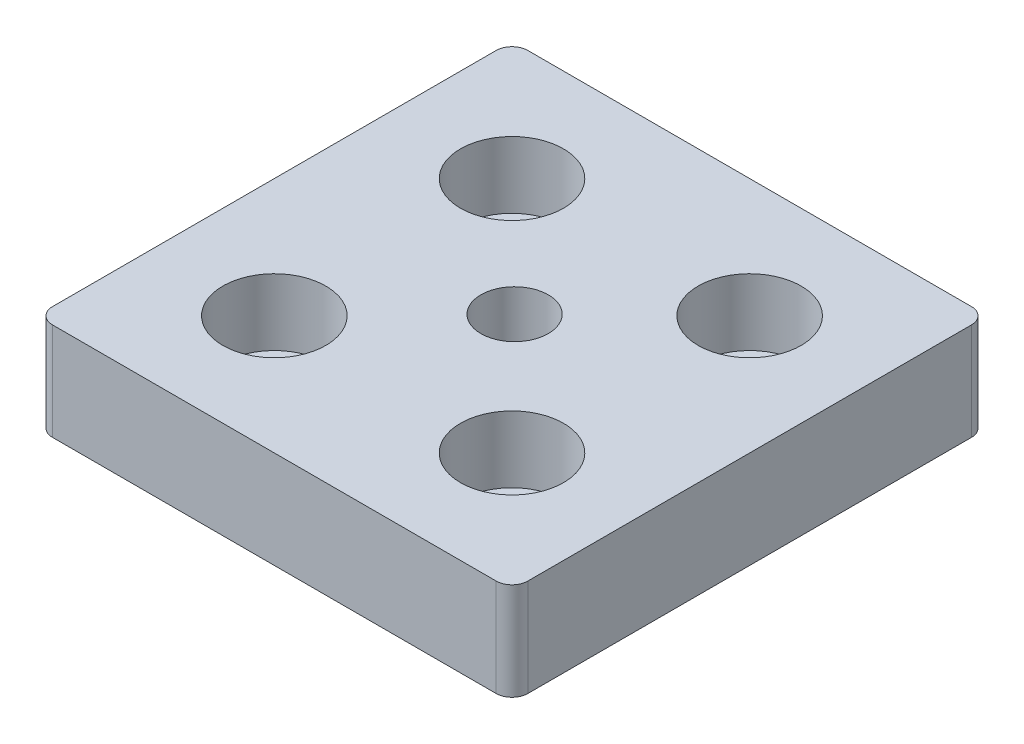
ISO-10303-21;
HEADER;
FILE_DESCRIPTION(('STEP AP214'),'2;1');
FILE_NAME('part.step','',(''),(''),'','','');
FILE_SCHEMA(('AUTOMOTIVE_DESIGN { 1 0 10303 214 1 1 1 1 }'));
ENDSEC;
DATA;
#1=APPLICATION_CONTEXT('core data for automotive mechanical design processes');
#2=APPLICATION_PROTOCOL_DEFINITION('international standard','automotive_design',2000,#1);
#3=PRODUCT_CONTEXT('',#1,'mechanical');
#4=PRODUCT('Part','Part','',(#3));
#5=PRODUCT_RELATED_PRODUCT_CATEGORY('part','',(#4));
#6=PRODUCT_DEFINITION_FORMATION('','',#4);
#7=PRODUCT_DEFINITION_CONTEXT('part definition',#1,'design');
#8=PRODUCT_DEFINITION('design','',#6,#7);
#9=PRODUCT_DEFINITION_SHAPE('','',#8);
#10=(LENGTH_UNIT() NAMED_UNIT(*) SI_UNIT(.MILLI.,.METRE.));
#11=(NAMED_UNIT(*) PLANE_ANGLE_UNIT() SI_UNIT($,.RADIAN.));
#12=(NAMED_UNIT(*) SI_UNIT($,.STERADIAN.) SOLID_ANGLE_UNIT());
#13=UNCERTAINTY_MEASURE_WITH_UNIT(LENGTH_MEASURE(1.E-05),#10,'distance_accuracy_value','');
#14=(GEOMETRIC_REPRESENTATION_CONTEXT(3) GLOBAL_UNCERTAINTY_ASSIGNED_CONTEXT((#13)) GLOBAL_UNIT_ASSIGNED_CONTEXT((#10,
#11,#12)) REPRESENTATION_CONTEXT('',''));
#15=CARTESIAN_POINT('',(0.,0.,0.));
#16=DIRECTION('',(0.,0.,1.));
#17=DIRECTION('',(1.,0.,0.));
#18=AXIS2_PLACEMENT_3D('',#15,#16,#17);
#19=CARTESIAN_POINT('',(-14.993607342611,12.3,15.3305364339358));
#20=DIRECTION('',(0.,-1.,0.));
#21=DIRECTION('',(0.,0.,-1.));
#22=AXIS2_PLACEMENT_3D('',#19,#20,#21);
#23=CYLINDRICAL_SURFACE('',#22,4.5);
#24=CARTESIAN_POINT('',(-14.993607342611,0.,15.3305364339358));
#25=DIRECTION('',(0.,1.,0.));
#26=DIRECTION('',(0.,0.,1.));
#27=AXIS2_PLACEMENT_3D('',#24,#25,#26);
#28=CIRCLE('',#27,4.5);
#29=CARTESIAN_POINT('',(-14.993607342611,0.,19.8305364339358));
#30=VERTEX_POINT('',#29);
#31=EDGE_CURVE('E202',#30,#30,#28,.T.);
#32=ORIENTED_EDGE('',*,*,#31,.F.);
#33=EDGE_LOOP('',(#32));
#34=FACE_BOUND('',#33,.T.);
#35=CARTESIAN_POINT('',(-14.993607342611,3.9,15.3305364339358));
#36=DIRECTION('',(0.,1.,0.));
#37=DIRECTION('',(0.,0.,1.));
#38=AXIS2_PLACEMENT_3D('',#35,#36,#37);
#39=CIRCLE('',#38,4.5);
#40=CARTESIAN_POINT('',(-14.993607342611,3.9,19.8305364339358));
#41=VERTEX_POINT('',#40);
#42=EDGE_CURVE('E41',#41,#41,#39,.T.);
#43=ORIENTED_EDGE('',*,*,#42,.T.);
#44=EDGE_LOOP('',(#43));
#45=FACE_BOUND('',#44,.T.);
#46=ADVANCED_FACE('F37',(#34,#45),#23,.F.);
#47=CARTESIAN_POINT('',(15.006392657389,12.3,15.3305364339356));
#48=DIRECTION('',(0.,-1.,0.));
#49=DIRECTION('',(0.,0.,-1.));
#50=AXIS2_PLACEMENT_3D('',#47,#48,#49);
#51=CYLINDRICAL_SURFACE('',#50,4.5);
#52=CARTESIAN_POINT('',(15.006392657389,0.,15.3305364339356));
#53=DIRECTION('',(0.,1.,0.));
#54=DIRECTION('',(0.,0.,1.));
#55=AXIS2_PLACEMENT_3D('',#52,#53,#54);
#56=CIRCLE('',#55,4.5);
#57=CARTESIAN_POINT('',(15.006392657389,0.,19.8305364339356));
#58=VERTEX_POINT('',#57);
#59=EDGE_CURVE('E140',#58,#58,#56,.T.);
#60=ORIENTED_EDGE('',*,*,#59,.F.);
#61=EDGE_LOOP('',(#60));
#62=FACE_BOUND('',#61,.T.);
#63=CARTESIAN_POINT('',(15.006392657389,3.9,15.3305364339356));
#64=DIRECTION('',(0.,1.,0.));
#65=DIRECTION('',(0.,0.,1.));
#66=AXIS2_PLACEMENT_3D('',#63,#64,#65);
#67=CIRCLE('',#66,4.5);
#68=CARTESIAN_POINT('',(15.006392657389,3.9,19.8305364339356));
#69=VERTEX_POINT('',#68);
#70=EDGE_CURVE('E172',#69,#69,#67,.T.);
#71=ORIENTED_EDGE('',*,*,#70,.T.);
#72=EDGE_LOOP('',(#71));
#73=FACE_BOUND('',#72,.T.);
#74=ADVANCED_FACE('F250',(#62,#73),#51,.F.);
#75=CARTESIAN_POINT('',(15.006392657389,12.3,-14.6694635660642));
#76=DIRECTION('',(0.,-1.,0.));
#77=DIRECTION('',(0.,0.,-1.));
#78=AXIS2_PLACEMENT_3D('',#75,#76,#77);
#79=CYLINDRICAL_SURFACE('',#78,4.5);
#80=CARTESIAN_POINT('',(15.006392657389,0.,-14.6694635660642));
#81=DIRECTION('',(0.,1.,0.));
#82=DIRECTION('',(0.,0.,1.));
#83=AXIS2_PLACEMENT_3D('',#80,#81,#82);
#84=CIRCLE('',#83,4.5);
#85=CARTESIAN_POINT('',(15.006392657389,0.,-10.1694635660642));
#86=VERTEX_POINT('',#85);
#87=EDGE_CURVE('E208',#86,#86,#84,.T.);
#88=ORIENTED_EDGE('',*,*,#87,.F.);
#89=EDGE_LOOP('',(#88));
#90=FACE_BOUND('',#89,.T.);
#91=CARTESIAN_POINT('',(15.006392657389,3.9,-14.6694635660642));
#92=DIRECTION('',(0.,1.,0.));
#93=DIRECTION('',(0.,0.,1.));
#94=AXIS2_PLACEMENT_3D('',#91,#92,#93);
#95=CIRCLE('',#94,4.5);
#96=CARTESIAN_POINT('',(15.006392657389,3.9,-10.1694635660642));
#97=VERTEX_POINT('',#96);
#98=EDGE_CURVE('E168',#97,#97,#95,.T.);
#99=ORIENTED_EDGE('',*,*,#98,.T.);
#100=EDGE_LOOP('',(#99));
#101=FACE_BOUND('',#100,.T.);
#102=ADVANCED_FACE('F256',(#90,#101),#79,.F.);
#103=CARTESIAN_POINT('',(-14.9936073426113,12.3,-14.6694635660642));
#104=DIRECTION('',(0.,-1.,0.));
#105=DIRECTION('',(0.,0.,-1.));
#106=AXIS2_PLACEMENT_3D('',#103,#104,#105);
#107=CYLINDRICAL_SURFACE('',#106,4.5);
#108=CARTESIAN_POINT('',(-14.9936073426113,0.,-14.6694635660642));
#109=DIRECTION('',(0.,1.,0.));
#110=DIRECTION('',(0.,0.,1.));
#111=AXIS2_PLACEMENT_3D('',#108,#109,#110);
#112=CIRCLE('',#111,4.5);
#113=CARTESIAN_POINT('',(-14.9936073426113,0.,-10.1694635660642));
#114=VERTEX_POINT('',#113);
#115=EDGE_CURVE('E205',#114,#114,#112,.T.);
#116=ORIENTED_EDGE('',*,*,#115,.F.);
#117=EDGE_LOOP('',(#116));
#118=FACE_BOUND('',#117,.T.);
#119=CARTESIAN_POINT('',(-14.9936073426113,3.9,-14.6694635660642));
#120=DIRECTION('',(0.,1.,0.));
#121=DIRECTION('',(0.,0.,1.));
#122=AXIS2_PLACEMENT_3D('',#119,#120,#121);
#123=CIRCLE('',#122,4.5);
#124=CARTESIAN_POINT('',(-14.9936073426113,3.9,-10.1694635660642));
#125=VERTEX_POINT('',#124);
#126=EDGE_CURVE('E163',#125,#125,#123,.T.);
#127=ORIENTED_EDGE('',*,*,#126,.T.);
#128=EDGE_LOOP('',(#127));
#129=FACE_BOUND('',#128,.T.);
#130=ADVANCED_FACE('F263',(#118,#129),#107,.F.);
#131=CARTESIAN_POINT('',(-27.993607342611,12.3,28.3305364339356));
#132=DIRECTION('',(0.,1.,0.));
#133=DIRECTION('',(0.,0.,1.));
#134=AXIS2_PLACEMENT_3D('',#131,#132,#133);
#135=PLANE('',#134);
#136=CARTESIAN_POINT('',(-14.993607342611,12.3,15.3305364339358));
#137=DIRECTION('',(0.,1.,0.));
#138=DIRECTION('',(0.,0.,1.));
#139=AXIS2_PLACEMENT_3D('',#136,#137,#138);
#140=CIRCLE('',#139,6.5);
#141=CARTESIAN_POINT('',(-14.993607342611,12.3,21.8305364339358));
#142=VERTEX_POINT('',#141);
#143=EDGE_CURVE('E188',#142,#142,#140,.T.);
#144=ORIENTED_EDGE('',*,*,#143,.F.);
#145=EDGE_LOOP('',(#144));
#146=FACE_BOUND('',#145,.T.);
#147=CARTESIAN_POINT('',(15.006392657389,12.3,15.3305364339356));
#148=DIRECTION('',(0.,1.,0.));
#149=DIRECTION('',(0.,0.,1.));
#150=AXIS2_PLACEMENT_3D('',#147,#148,#149);
#151=CIRCLE('',#150,6.5);
#152=CARTESIAN_POINT('',(15.006392657389,12.3,21.8305364339356));
#153=VERTEX_POINT('',#152);
#154=EDGE_CURVE('E181',#153,#153,#151,.T.);
#155=ORIENTED_EDGE('',*,*,#154,.F.);
#156=EDGE_LOOP('',(#155));
#157=FACE_BOUND('',#156,.T.);
#158=CARTESIAN_POINT('',(15.006392657389,12.3,-14.6694635660642));
#159=DIRECTION('',(0.,1.,0.));
#160=DIRECTION('',(0.,0.,1.));
#161=AXIS2_PLACEMENT_3D('',#158,#159,#160);
#162=CIRCLE('',#161,6.5);
#163=CARTESIAN_POINT('',(15.006392657389,12.3,-8.16946356606417));
#164=VERTEX_POINT('',#163);
#165=EDGE_CURVE('E174',#164,#164,#162,.T.);
#166=ORIENTED_EDGE('',*,*,#165,.F.);
#167=EDGE_LOOP('',(#166));
#168=FACE_BOUND('',#167,.T.);
#169=CARTESIAN_POINT('',(-14.9936073426113,12.3,-14.6694635660642));
#170=DIRECTION('',(0.,1.,0.));
#171=DIRECTION('',(0.,0.,1.));
#172=AXIS2_PLACEMENT_3D('',#169,#170,#171);
#173=CIRCLE('',#172,6.5);
#174=CARTESIAN_POINT('',(-14.9936073426113,12.3,-8.16946356606417));
#175=VERTEX_POINT('',#174);
#176=EDGE_CURVE('E170',#175,#175,#173,.T.);
#177=ORIENTED_EDGE('',*,*,#176,.F.);
#178=EDGE_LOOP('',(#177));
#179=FACE_BOUND('',#178,.T.);
#180=CARTESIAN_POINT('',(0.,12.3,0.));
#181=DIRECTION('',(0.,1.,0.));
#182=DIRECTION('',(0.,0.,1.));
#183=AXIS2_PLACEMENT_3D('',#180,#181,#182);
#184=CIRCLE('',#183,4.25);
#185=CARTESIAN_POINT('',(0.,12.3,4.25));
#186=VERTEX_POINT('',#185);
#187=EDGE_CURVE('E166',#186,#186,#184,.T.);
#188=ORIENTED_EDGE('',*,*,#187,.F.);
#189=EDGE_LOOP('',(#188));
#190=FACE_BOUND('',#189,.T.);
#191=CARTESIAN_POINT('',(-27.993607342611,12.3,28.3305364339356));
#192=DIRECTION('',(0.,1.,0.));
#193=DIRECTION('',(0.,0.,1.));
#194=AXIS2_PLACEMENT_3D('',#191,#192,#193);
#195=CIRCLE('',#194,2.);
#196=CARTESIAN_POINT('',(-29.993607342611,12.3,28.3305364339356));
#197=VERTEX_POINT('',#196);
#198=CARTESIAN_POINT('',(-27.993607342611,12.3,30.3305364339356));
#199=VERTEX_POINT('',#198);
#200=EDGE_CURVE('E151',#197,#199,#195,.T.);
#201=ORIENTED_EDGE('',*,*,#200,.T.);
#202=DIRECTION('',(1.,0.,0.));
#203=VECTOR('',#202,1.);
#204=CARTESIAN_POINT('',(-27.993607342611,12.3,30.3305364339356));
#205=LINE('',#204,#203);
#206=CARTESIAN_POINT('',(28.0063926573892,12.3,30.3305364339356));
#207=VERTEX_POINT('',#206);
#208=EDGE_CURVE('E99',#199,#207,#205,.T.);
#209=ORIENTED_EDGE('',*,*,#208,.T.);
#210=CARTESIAN_POINT('',(28.0063926573892,12.3,28.3305364339356));
#211=DIRECTION('',(0.,1.,0.));
#212=DIRECTION('',(0.,0.,1.));
#213=AXIS2_PLACEMENT_3D('',#210,#211,#212);
#214=CIRCLE('',#213,1.99999999999999);
#215=CARTESIAN_POINT('',(30.0063926573892,12.3,28.3305364339356));
#216=VERTEX_POINT('',#215);
#217=EDGE_CURVE('E215',#207,#216,#214,.T.);
#218=ORIENTED_EDGE('',*,*,#217,.T.);
#219=DIRECTION('',(0.,0.,-1.));
#220=VECTOR('',#219,1.);
#221=CARTESIAN_POINT('',(30.0063926573892,12.3,28.3305364339356));
#222=LINE('',#221,#220);
#223=CARTESIAN_POINT('',(30.0063926573892,12.3,-27.6694635660644));
#224=VERTEX_POINT('',#223);
#225=EDGE_CURVE('E217',#216,#224,#222,.T.);
#226=ORIENTED_EDGE('',*,*,#225,.T.);
#227=CARTESIAN_POINT('',(28.0063926573892,12.3,-27.6694635660644));
#228=DIRECTION('',(0.,1.,0.));
#229=DIRECTION('',(0.,0.,1.));
#230=AXIS2_PLACEMENT_3D('',#227,#228,#229);
#231=CIRCLE('',#230,2.);
#232=CARTESIAN_POINT('',(28.0063926573892,12.3,-29.6694635660644));
#233=VERTEX_POINT('',#232);
#234=EDGE_CURVE('E118',#224,#233,#231,.T.);
#235=ORIENTED_EDGE('',*,*,#234,.T.);
#236=DIRECTION('',(-1.,0.,0.));
#237=VECTOR('',#236,1.);
#238=CARTESIAN_POINT('',(28.0063926573892,12.3,-29.6694635660644));
#239=LINE('',#238,#237);
#240=CARTESIAN_POINT('',(-27.993607342611,12.3,-29.6694635660644));
#241=VERTEX_POINT('',#240);
#242=EDGE_CURVE('E112',#233,#241,#239,.T.);
#243=ORIENTED_EDGE('',*,*,#242,.T.);
#244=CARTESIAN_POINT('',(-27.993607342611,12.3,-27.6694635660644));
#245=DIRECTION('',(0.,1.,0.));
#246=DIRECTION('',(0.,0.,1.));
#247=AXIS2_PLACEMENT_3D('',#244,#245,#246);
#248=CIRCLE('',#247,2.);
#249=CARTESIAN_POINT('',(-29.993607342611,12.3,-27.6694635660644));
#250=VERTEX_POINT('',#249);
#251=EDGE_CURVE('E116',#241,#250,#248,.T.);
#252=ORIENTED_EDGE('',*,*,#251,.T.);
#253=DIRECTION('',(0.,0.,1.));
#254=VECTOR('',#253,1.);
#255=CARTESIAN_POINT('',(-29.993607342611,12.3,-27.6694635660644));
#256=LINE('',#255,#254);
#257=EDGE_CURVE('E56',#250,#197,#256,.T.);
#258=ORIENTED_EDGE('',*,*,#257,.T.);
#259=EDGE_LOOP('',(#201,#209,#218,#226,#235,#243,#252,#258));
#260=FACE_BOUND('',#259,.T.);
#261=ADVANCED_FACE('F114',(#146,#157,#168,#179,#190,#260),#135,.T.);
#262=CARTESIAN_POINT('',(-27.993607342611,0.,28.3305364339356));
#263=DIRECTION('',(0.,1.,0.));
#264=DIRECTION('',(0.,0.,1.));
#265=AXIS2_PLACEMENT_3D('',#262,#263,#264);
#266=PLANE('',#265);
#267=CARTESIAN_POINT('',(0.,0.,0.));
#268=DIRECTION('',(0.,1.,0.));
#269=DIRECTION('',(0.,0.,1.));
#270=AXIS2_PLACEMENT_3D('',#267,#268,#269);
#271=CIRCLE('',#270,4.25);
#272=CARTESIAN_POINT('',(0.,0.,4.25));
#273=VERTEX_POINT('',#272);
#274=EDGE_CURVE('E199',#273,#273,#271,.T.);
#275=ORIENTED_EDGE('',*,*,#274,.T.);
#276=EDGE_LOOP('',(#275));
#277=FACE_BOUND('',#276,.T.);
#278=ORIENTED_EDGE('',*,*,#115,.T.);
#279=EDGE_LOOP('',(#278));
#280=FACE_BOUND('',#279,.T.);
#281=ORIENTED_EDGE('',*,*,#59,.T.);
#282=EDGE_LOOP('',(#281));
#283=FACE_BOUND('',#282,.T.);
#284=CARTESIAN_POINT('',(-27.993607342611,0.,28.3305364339356));
#285=DIRECTION('',(0.,1.,0.));
#286=DIRECTION('',(0.,0.,1.));
#287=AXIS2_PLACEMENT_3D('',#284,#285,#286);
#288=CIRCLE('',#287,2.);
#289=CARTESIAN_POINT('',(-29.993607342611,0.,28.3305364339356));
#290=VERTEX_POINT('',#289);
#291=CARTESIAN_POINT('',(-27.993607342611,0.,30.3305364339356));
#292=VERTEX_POINT('',#291);
#293=EDGE_CURVE('E136',#290,#292,#288,.T.);
#294=ORIENTED_EDGE('',*,*,#293,.F.);
#295=DIRECTION('',(0.,0.,1.));
#296=VECTOR('',#295,1.);
#297=CARTESIAN_POINT('',(-29.993607342611,0.,-27.6694635660644));
#298=LINE('',#297,#296);
#299=CARTESIAN_POINT('',(-29.993607342611,0.,-27.6694635660644));
#300=VERTEX_POINT('',#299);
#301=EDGE_CURVE('E91',#300,#290,#298,.T.);
#302=ORIENTED_EDGE('',*,*,#301,.F.);
#303=CARTESIAN_POINT('',(-27.993607342611,0.,-27.6694635660644));
#304=DIRECTION('',(0.,1.,0.));
#305=DIRECTION('',(0.,0.,1.));
#306=AXIS2_PLACEMENT_3D('',#303,#304,#305);
#307=CIRCLE('',#306,2.);
#308=CARTESIAN_POINT('',(-27.993607342611,0.,-29.6694635660644));
#309=VERTEX_POINT('',#308);
#310=EDGE_CURVE('E85',#309,#300,#307,.T.);
#311=ORIENTED_EDGE('',*,*,#310,.F.);
#312=DIRECTION('',(-1.,0.,0.));
#313=VECTOR('',#312,1.);
#314=CARTESIAN_POINT('',(28.0063926573892,0.,-29.6694635660644));
#315=LINE('',#314,#313);
#316=CARTESIAN_POINT('',(28.0063926573892,0.,-29.6694635660644));
#317=VERTEX_POINT('',#316);
#318=EDGE_CURVE('E126',#317,#309,#315,.T.);
#319=ORIENTED_EDGE('',*,*,#318,.F.);
#320=CARTESIAN_POINT('',(28.0063926573892,0.,-27.6694635660644));
#321=DIRECTION('',(0.,1.,0.));
#322=DIRECTION('',(0.,0.,1.));
#323=AXIS2_PLACEMENT_3D('',#320,#321,#322);
#324=CIRCLE('',#323,2.);
#325=CARTESIAN_POINT('',(30.0063926573892,0.,-27.6694635660644));
#326=VERTEX_POINT('',#325);
#327=EDGE_CURVE('E146',#326,#317,#324,.T.);
#328=ORIENTED_EDGE('',*,*,#327,.F.);
#329=DIRECTION('',(0.,0.,-1.));
#330=VECTOR('',#329,1.);
#331=CARTESIAN_POINT('',(30.0063926573892,0.,28.3305364339356));
#332=LINE('',#331,#330);
#333=CARTESIAN_POINT('',(30.0063926573892,0.,28.3305364339356));
#334=VERTEX_POINT('',#333);
#335=EDGE_CURVE('E144',#334,#326,#332,.T.);
#336=ORIENTED_EDGE('',*,*,#335,.F.);
#337=CARTESIAN_POINT('',(28.0063926573892,0.,28.3305364339356));
#338=DIRECTION('',(0.,1.,0.));
#339=DIRECTION('',(0.,0.,1.));
#340=AXIS2_PLACEMENT_3D('',#337,#338,#339);
#341=CIRCLE('',#340,1.99999999999999);
#342=CARTESIAN_POINT('',(28.0063926573892,0.,30.3305364339356));
#343=VERTEX_POINT('',#342);
#344=EDGE_CURVE('E142',#343,#334,#341,.T.);
#345=ORIENTED_EDGE('',*,*,#344,.F.);
#346=DIRECTION('',(1.,0.,0.));
#347=VECTOR('',#346,1.);
#348=CARTESIAN_POINT('',(-27.993607342611,0.,30.3305364339356));
#349=LINE('',#348,#347);
#350=EDGE_CURVE('E139',#292,#343,#349,.T.);
#351=ORIENTED_EDGE('',*,*,#350,.F.);
#352=EDGE_LOOP('',(#294,#302,#311,#319,#328,#336,#345,#351));
#353=FACE_BOUND('',#352,.T.);
#354=ORIENTED_EDGE('',*,*,#87,.T.);
#355=EDGE_LOOP('',(#354));
#356=FACE_BOUND('',#355,.T.);
#357=ORIENTED_EDGE('',*,*,#31,.T.);
#358=EDGE_LOOP('',(#357));
#359=FACE_BOUND('',#358,.T.);
#360=ADVANCED_FACE('F230',(#277,#280,#283,#353,#356,#359),#266,.F.);
#361=CARTESIAN_POINT('',(-27.993607342611,12.3,28.3305364339356));
#362=DIRECTION('',(0.,-1.,0.));
#363=DIRECTION('',(0.,0.,-1.));
#364=AXIS2_PLACEMENT_3D('',#361,#362,#363);
#365=CYLINDRICAL_SURFACE('',#364,2.);
#366=ORIENTED_EDGE('',*,*,#293,.T.);
#367=DIRECTION('',(0.,-1.,0.));
#368=VECTOR('',#367,1.);
#369=CARTESIAN_POINT('',(-27.993607342611,12.3,30.3305364339356));
#370=LINE('',#369,#368);
#371=EDGE_CURVE('E11',#199,#292,#370,.T.);
#372=ORIENTED_EDGE('',*,*,#371,.F.);
#373=ORIENTED_EDGE('',*,*,#200,.F.);
#374=DIRECTION('',(0.,-1.,0.));
#375=VECTOR('',#374,1.);
#376=CARTESIAN_POINT('',(-29.993607342611,12.3,28.3305364339356));
#377=LINE('',#376,#375);
#378=EDGE_CURVE('E132',#197,#290,#377,.T.);
#379=ORIENTED_EDGE('',*,*,#378,.T.);
#380=EDGE_LOOP('',(#366,#372,#373,#379));
#381=FACE_BOUND('',#380,.T.);
#382=ADVANCED_FACE('F39',(#381),#365,.T.);
#383=CARTESIAN_POINT('',(-27.993607342611,12.3,30.3305364339356));
#384=DIRECTION('',(0.,0.,-1.));
#385=DIRECTION('',(-1.,0.,0.));
#386=AXIS2_PLACEMENT_3D('',#383,#384,#385);
#387=PLANE('',#386);
#388=ORIENTED_EDGE('',*,*,#350,.T.);
#389=DIRECTION('',(0.,-1.,0.));
#390=VECTOR('',#389,1.);
#391=CARTESIAN_POINT('',(28.0063926573892,12.3,30.3305364339356));
#392=LINE('',#391,#390);
#393=EDGE_CURVE('E47',#207,#343,#392,.T.);
#394=ORIENTED_EDGE('',*,*,#393,.F.);
#395=ORIENTED_EDGE('',*,*,#208,.F.);
#396=ORIENTED_EDGE('',*,*,#371,.T.);
#397=EDGE_LOOP('',(#388,#394,#395,#396));
#398=FACE_BOUND('',#397,.T.);
#399=ADVANCED_FACE('F277',(#398),#387,.F.);
#400=CARTESIAN_POINT('',(28.0063926573892,12.3,28.3305364339356));
#401=DIRECTION('',(0.,-1.,0.));
#402=DIRECTION('',(0.,0.,-1.));
#403=AXIS2_PLACEMENT_3D('',#400,#401,#402);
#404=CYLINDRICAL_SURFACE('',#403,1.99999999999999);
#405=ORIENTED_EDGE('',*,*,#344,.T.);
#406=DIRECTION('',(0.,-1.,0.));
#407=VECTOR('',#406,1.);
#408=CARTESIAN_POINT('',(30.0063926573892,12.3,28.3305364339356));
#409=LINE('',#408,#407);
#410=EDGE_CURVE('E158',#216,#334,#409,.T.);
#411=ORIENTED_EDGE('',*,*,#410,.F.);
#412=ORIENTED_EDGE('',*,*,#217,.F.);
#413=ORIENTED_EDGE('',*,*,#393,.T.);
#414=EDGE_LOOP('',(#405,#411,#412,#413));
#415=FACE_BOUND('',#414,.T.);
#416=ADVANCED_FACE('F445',(#415),#404,.T.);
#417=CARTESIAN_POINT('',(30.0063926573892,12.3,28.3305364339356));
#418=DIRECTION('',(-1.,0.,0.));
#419=DIRECTION('',(0.,0.,1.));
#420=AXIS2_PLACEMENT_3D('',#417,#418,#419);
#421=PLANE('',#420);
#422=ORIENTED_EDGE('',*,*,#335,.T.);
#423=DIRECTION('',(0.,-1.,0.));
#424=VECTOR('',#423,1.);
#425=CARTESIAN_POINT('',(30.0063926573892,12.3,-27.6694635660644));
#426=LINE('',#425,#424);
#427=EDGE_CURVE('E155',#224,#326,#426,.T.);
#428=ORIENTED_EDGE('',*,*,#427,.F.);
#429=ORIENTED_EDGE('',*,*,#225,.F.);
#430=ORIENTED_EDGE('',*,*,#410,.T.);
#431=EDGE_LOOP('',(#422,#428,#429,#430));
#432=FACE_BOUND('',#431,.T.);
#433=ADVANCED_FACE('F223',(#432),#421,.F.);
#434=CARTESIAN_POINT('',(28.0063926573892,12.3,-27.6694635660644));
#435=DIRECTION('',(0.,-1.,0.));
#436=DIRECTION('',(0.,0.,-1.));
#437=AXIS2_PLACEMENT_3D('',#434,#435,#436);
#438=CYLINDRICAL_SURFACE('',#437,2.);
#439=ORIENTED_EDGE('',*,*,#327,.T.);
#440=DIRECTION('',(0.,-1.,0.));
#441=VECTOR('',#440,1.);
#442=CARTESIAN_POINT('',(28.0063926573892,12.3,-29.6694635660644));
#443=LINE('',#442,#441);
#444=EDGE_CURVE('E127',#233,#317,#443,.T.);
#445=ORIENTED_EDGE('',*,*,#444,.F.);
#446=ORIENTED_EDGE('',*,*,#234,.F.);
#447=ORIENTED_EDGE('',*,*,#427,.T.);
#448=EDGE_LOOP('',(#439,#445,#446,#447));
#449=FACE_BOUND('',#448,.T.);
#450=ADVANCED_FACE('F227',(#449),#438,.T.);
#451=CARTESIAN_POINT('',(28.0063926573892,12.3,-29.6694635660644));
#452=DIRECTION('',(0.,0.,1.));
#453=DIRECTION('',(1.,0.,0.));
#454=AXIS2_PLACEMENT_3D('',#451,#452,#453);
#455=PLANE('',#454);
#456=ORIENTED_EDGE('',*,*,#318,.T.);
#457=DIRECTION('',(0.,-1.,0.));
#458=VECTOR('',#457,1.);
#459=CARTESIAN_POINT('',(-27.993607342611,12.3,-29.6694635660644));
#460=LINE('',#459,#458);
#461=EDGE_CURVE('E123',#241,#309,#460,.T.);
#462=ORIENTED_EDGE('',*,*,#461,.F.);
#463=ORIENTED_EDGE('',*,*,#242,.F.);
#464=ORIENTED_EDGE('',*,*,#444,.T.);
#465=EDGE_LOOP('',(#456,#462,#463,#464));
#466=FACE_BOUND('',#465,.T.);
#467=ADVANCED_FACE('F124',(#466),#455,.F.);
#468=CARTESIAN_POINT('',(-27.993607342611,12.3,-27.6694635660644));
#469=DIRECTION('',(0.,-1.,0.));
#470=DIRECTION('',(0.,0.,-1.));
#471=AXIS2_PLACEMENT_3D('',#468,#469,#470);
#472=CYLINDRICAL_SURFACE('',#471,2.);
#473=ORIENTED_EDGE('',*,*,#310,.T.);
#474=DIRECTION('',(0.,-1.,0.));
#475=VECTOR('',#474,1.);
#476=CARTESIAN_POINT('',(-29.993607342611,12.3,-27.6694635660644));
#477=LINE('',#476,#475);
#478=EDGE_CURVE('E128',#250,#300,#477,.T.);
#479=ORIENTED_EDGE('',*,*,#478,.F.);
#480=ORIENTED_EDGE('',*,*,#251,.F.);
#481=ORIENTED_EDGE('',*,*,#461,.T.);
#482=EDGE_LOOP('',(#473,#479,#480,#481));
#483=FACE_BOUND('',#482,.T.);
#484=ADVANCED_FACE('F130',(#483),#472,.T.);
#485=CARTESIAN_POINT('',(-29.993607342611,12.3,-27.6694635660644));
#486=DIRECTION('',(1.,0.,0.));
#487=DIRECTION('',(0.,0.,-1.));
#488=AXIS2_PLACEMENT_3D('',#485,#486,#487);
#489=PLANE('',#488);
#490=ORIENTED_EDGE('',*,*,#301,.T.);
#491=ORIENTED_EDGE('',*,*,#378,.F.);
#492=ORIENTED_EDGE('',*,*,#257,.F.);
#493=ORIENTED_EDGE('',*,*,#478,.T.);
#494=EDGE_LOOP('',(#490,#491,#492,#493));
#495=FACE_BOUND('',#494,.T.);
#496=ADVANCED_FACE('F236',(#495),#489,.F.);
#497=CARTESIAN_POINT('',(0.,12.3,0.));
#498=DIRECTION('',(0.,1.,0.));
#499=DIRECTION('',(0.,0.,1.));
#500=AXIS2_PLACEMENT_3D('',#497,#498,#499);
#501=CYLINDRICAL_SURFACE('',#500,4.25);
#502=ORIENTED_EDGE('',*,*,#187,.T.);
#503=EDGE_LOOP('',(#502));
#504=FACE_BOUND('',#503,.T.);
#505=ORIENTED_EDGE('',*,*,#274,.F.);
#506=EDGE_LOOP('',(#505));
#507=FACE_BOUND('',#506,.T.);
#508=ADVANCED_FACE('F238',(#504,#507),#501,.F.);
#509=CARTESIAN_POINT('',(-14.9936073426113,3.9,-14.6694635660642));
#510=DIRECTION('',(0.,1.,0.));
#511=DIRECTION('',(0.,0.,1.));
#512=AXIS2_PLACEMENT_3D('',#509,#510,#511);
#513=CYLINDRICAL_SURFACE('',#512,6.5);
#514=CARTESIAN_POINT('',(-14.9936073426113,3.9,-14.6694635660642));
#515=DIRECTION('',(0.,1.,0.));
#516=DIRECTION('',(0.,0.,1.));
#517=AXIS2_PLACEMENT_3D('',#514,#515,#516);
#518=CIRCLE('',#517,6.5);
#519=CARTESIAN_POINT('',(-14.9936073426113,3.9,-8.16946356606417));
#520=VERTEX_POINT('',#519);
#521=EDGE_CURVE('E167',#520,#520,#518,.T.);
#522=ORIENTED_EDGE('',*,*,#521,.F.);
#523=EDGE_LOOP('',(#522));
#524=FACE_BOUND('',#523,.T.);
#525=ORIENTED_EDGE('',*,*,#176,.T.);
#526=EDGE_LOOP('',(#525));
#527=FACE_BOUND('',#526,.T.);
#528=ADVANCED_FACE('F244',(#524,#527),#513,.F.);
#529=CARTESIAN_POINT('',(-14.9936073426113,3.9,-14.6694635660642));
#530=DIRECTION('',(0.,1.,0.));
#531=DIRECTION('',(0.,0.,1.));
#532=AXIS2_PLACEMENT_3D('',#529,#530,#531);
#533=PLANE('',#532);
#534=ORIENTED_EDGE('',*,*,#126,.F.);
#535=EDGE_LOOP('',(#534));
#536=FACE_BOUND('',#535,.T.);
#537=ORIENTED_EDGE('',*,*,#521,.T.);
#538=EDGE_LOOP('',(#537));
#539=FACE_BOUND('',#538,.T.);
#540=ADVANCED_FACE('F286',(#536,#539),#533,.T.);
#541=CARTESIAN_POINT('',(15.006392657389,3.9,-14.6694635660642));
#542=DIRECTION('',(0.,1.,0.));
#543=DIRECTION('',(0.,0.,1.));
#544=AXIS2_PLACEMENT_3D('',#541,#542,#543);
#545=CYLINDRICAL_SURFACE('',#544,6.5);
#546=CARTESIAN_POINT('',(15.006392657389,3.9,-14.6694635660642));
#547=DIRECTION('',(0.,1.,0.));
#548=DIRECTION('',(0.,0.,1.));
#549=AXIS2_PLACEMENT_3D('',#546,#547,#548);
#550=CIRCLE('',#549,6.5);
#551=CARTESIAN_POINT('',(15.006392657389,3.9,-8.16946356606417));
#552=VERTEX_POINT('',#551);
#553=EDGE_CURVE('E171',#552,#552,#550,.T.);
#554=ORIENTED_EDGE('',*,*,#553,.F.);
#555=EDGE_LOOP('',(#554));
#556=FACE_BOUND('',#555,.T.);
#557=ORIENTED_EDGE('',*,*,#165,.T.);
#558=EDGE_LOOP('',(#557));
#559=FACE_BOUND('',#558,.T.);
#560=ADVANCED_FACE('F289',(#556,#559),#545,.F.);
#561=CARTESIAN_POINT('',(15.006392657389,3.9,-14.6694635660642));
#562=DIRECTION('',(0.,1.,0.));
#563=DIRECTION('',(0.,0.,1.));
#564=AXIS2_PLACEMENT_3D('',#561,#562,#563);
#565=PLANE('',#564);
#566=ORIENTED_EDGE('',*,*,#98,.F.);
#567=EDGE_LOOP('',(#566));
#568=FACE_BOUND('',#567,.T.);
#569=ORIENTED_EDGE('',*,*,#553,.T.);
#570=EDGE_LOOP('',(#569));
#571=FACE_BOUND('',#570,.T.);
#572=ADVANCED_FACE('F305',(#568,#571),#565,.T.);
#573=CARTESIAN_POINT('',(15.006392657389,3.9,15.3305364339356));
#574=DIRECTION('',(0.,1.,0.));
#575=DIRECTION('',(0.,0.,1.));
#576=AXIS2_PLACEMENT_3D('',#573,#574,#575);
#577=CYLINDRICAL_SURFACE('',#576,6.5);
#578=CARTESIAN_POINT('',(15.006392657389,3.9,15.3305364339356));
#579=DIRECTION('',(0.,1.,0.));
#580=DIRECTION('',(0.,0.,1.));
#581=AXIS2_PLACEMENT_3D('',#578,#579,#580);
#582=CIRCLE('',#581,6.5);
#583=CARTESIAN_POINT('',(15.006392657389,3.9,21.8305364339356));
#584=VERTEX_POINT('',#583);
#585=EDGE_CURVE('E175',#584,#584,#582,.T.);
#586=ORIENTED_EDGE('',*,*,#585,.F.);
#587=EDGE_LOOP('',(#586));
#588=FACE_BOUND('',#587,.T.);
#589=ORIENTED_EDGE('',*,*,#154,.T.);
#590=EDGE_LOOP('',(#589));
#591=FACE_BOUND('',#590,.T.);
#592=ADVANCED_FACE('F309',(#588,#591),#577,.F.);
#593=CARTESIAN_POINT('',(15.006392657389,3.9,15.3305364339356));
#594=DIRECTION('',(0.,1.,0.));
#595=DIRECTION('',(0.,0.,1.));
#596=AXIS2_PLACEMENT_3D('',#593,#594,#595);
#597=PLANE('',#596);
#598=ORIENTED_EDGE('',*,*,#70,.F.);
#599=EDGE_LOOP('',(#598));
#600=FACE_BOUND('',#599,.T.);
#601=ORIENTED_EDGE('',*,*,#585,.T.);
#602=EDGE_LOOP('',(#601));
#603=FACE_BOUND('',#602,.T.);
#604=ADVANCED_FACE('F313',(#600,#603),#597,.T.);
#605=CARTESIAN_POINT('',(-14.993607342611,3.9,15.3305364339358));
#606=DIRECTION('',(0.,1.,0.));
#607=DIRECTION('',(0.,0.,1.));
#608=AXIS2_PLACEMENT_3D('',#605,#606,#607);
#609=CYLINDRICAL_SURFACE('',#608,6.5);
#610=CARTESIAN_POINT('',(-14.993607342611,3.9,15.3305364339358));
#611=DIRECTION('',(0.,1.,0.));
#612=DIRECTION('',(0.,0.,1.));
#613=AXIS2_PLACEMENT_3D('',#610,#611,#612);
#614=CIRCLE('',#613,6.5);
#615=CARTESIAN_POINT('',(-14.993607342611,3.9,21.8305364339358));
#616=VERTEX_POINT('',#615);
#617=EDGE_CURVE('E332',#616,#616,#614,.T.);
#618=ORIENTED_EDGE('',*,*,#617,.F.);
#619=EDGE_LOOP('',(#618));
#620=FACE_BOUND('',#619,.T.);
#621=ORIENTED_EDGE('',*,*,#143,.T.);
#622=EDGE_LOOP('',(#621));
#623=FACE_BOUND('',#622,.T.);
#624=ADVANCED_FACE('F317',(#620,#623),#609,.F.);
#625=CARTESIAN_POINT('',(-14.993607342611,3.9,15.3305364339358));
#626=DIRECTION('',(0.,1.,0.));
#627=DIRECTION('',(0.,0.,1.));
#628=AXIS2_PLACEMENT_3D('',#625,#626,#627);
#629=PLANE('',#628);
#630=ORIENTED_EDGE('',*,*,#42,.F.);
#631=EDGE_LOOP('',(#630));
#632=FACE_BOUND('',#631,.T.);
#633=ORIENTED_EDGE('',*,*,#617,.T.);
#634=EDGE_LOOP('',(#633));
#635=FACE_BOUND('',#634,.T.);
#636=ADVANCED_FACE('F321',(#632,#635),#629,.T.);
#637=CLOSED_SHELL('',(#46,#74,#102,#130,#261,#360,#382,#399,#416,#433,#450,#467,#484,#496,#508,
#528,#540,#560,#572,#592,#604,#624,#636));
#638=MANIFOLD_SOLID_BREP('B2',#637);
#639=ADVANCED_BREP_SHAPE_REPRESENTATION('',(#18,#638),#14);
#640=SHAPE_DEFINITION_REPRESENTATION(#9,#639);
ENDSEC;
END-ISO-10303-21;
